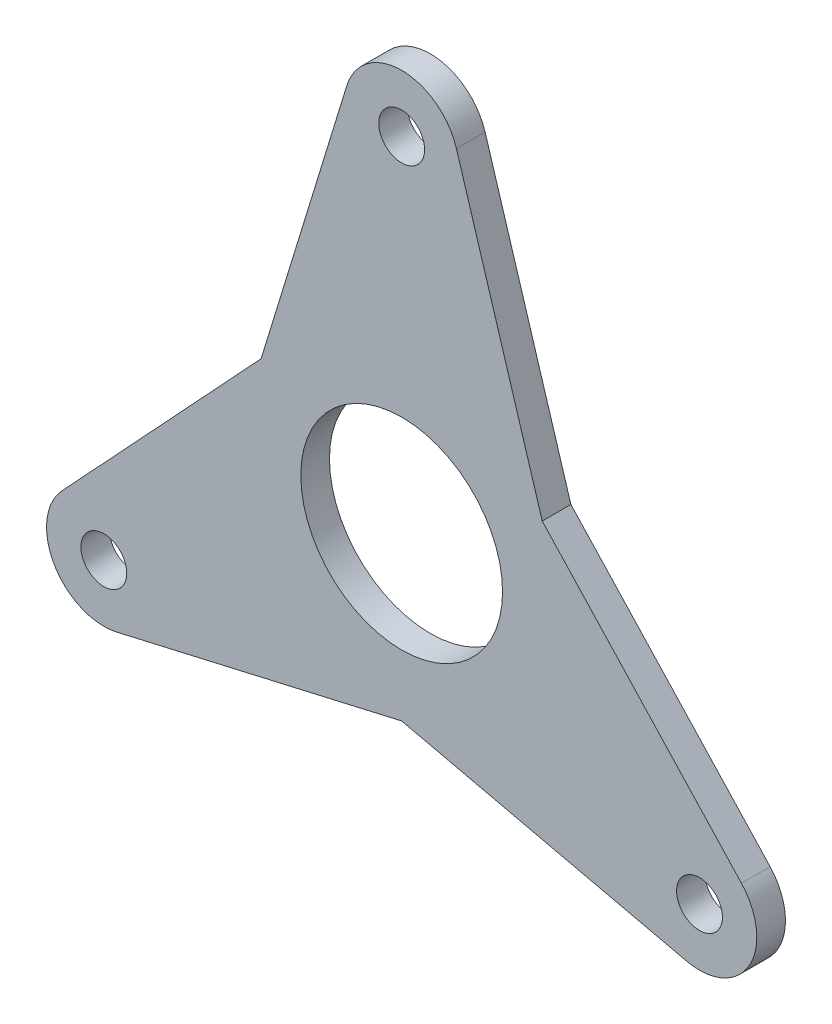
ISO-10303-21;
HEADER;
FILE_DESCRIPTION(('STEP AP214'),'2;1');
FILE_NAME('part.step','',(''),(''),'','','');
FILE_SCHEMA(('AUTOMOTIVE_DESIGN { 1 0 10303 214 1 1 1 1 }'));
ENDSEC;
DATA;
#1=APPLICATION_CONTEXT('core data for automotive mechanical design processes');
#2=APPLICATION_PROTOCOL_DEFINITION('international standard','automotive_design',2000,#1);
#3=PRODUCT_CONTEXT('',#1,'mechanical');
#4=PRODUCT('Part','Part','',(#3));
#5=PRODUCT_RELATED_PRODUCT_CATEGORY('part','',(#4));
#6=PRODUCT_DEFINITION_FORMATION('','',#4);
#7=PRODUCT_DEFINITION_CONTEXT('part definition',#1,'design');
#8=PRODUCT_DEFINITION('design','',#6,#7);
#9=PRODUCT_DEFINITION_SHAPE('','',#8);
#10=(LENGTH_UNIT() NAMED_UNIT(*) SI_UNIT(.MILLI.,.METRE.));
#11=(NAMED_UNIT(*) PLANE_ANGLE_UNIT() SI_UNIT($,.RADIAN.));
#12=(NAMED_UNIT(*) SI_UNIT($,.STERADIAN.) SOLID_ANGLE_UNIT());
#13=UNCERTAINTY_MEASURE_WITH_UNIT(LENGTH_MEASURE(1.E-05),#10,'distance_accuracy_value','');
#14=(GEOMETRIC_REPRESENTATION_CONTEXT(3) GLOBAL_UNCERTAINTY_ASSIGNED_CONTEXT((#13)) GLOBAL_UNIT_ASSIGNED_CONTEXT((#10,
#11,#12)) REPRESENTATION_CONTEXT('',''));
#15=CARTESIAN_POINT('',(0.,0.,0.));
#16=DIRECTION('',(0.,0.,1.));
#17=DIRECTION('',(1.,0.,0.));
#18=AXIS2_PLACEMENT_3D('',#15,#16,#17);
#19=CARTESIAN_POINT('',(0.,38.1,3.175));
#20=DIRECTION('',(0.,0.,1.));
#21=DIRECTION('',(1.,0.,0.));
#22=AXIS2_PLACEMENT_3D('',#19,#20,#21);
#23=PLANE('',#22);
#24=CARTESIAN_POINT('',(32.9955678841871,-19.05,3.175));
#25=DIRECTION('',(0.,0.,1.));
#26=DIRECTION('',(1.,0.,0.));
#27=AXIS2_PLACEMENT_3D('',#24,#25,#26);
#28=CIRCLE('',#27,2.54);
#29=CARTESIAN_POINT('',(35.5355678841871,-19.05,3.175));
#30=VERTEX_POINT('',#29);
#31=EDGE_CURVE('E204',#30,#30,#28,.T.);
#32=ORIENTED_EDGE('',*,*,#31,.F.);
#33=EDGE_LOOP('',(#32));
#34=FACE_BOUND('',#33,.T.);
#35=CARTESIAN_POINT('',(0.,0.,3.175));
#36=DIRECTION('',(0.,0.,1.));
#37=DIRECTION('',(1.,0.,0.));
#38=AXIS2_PLACEMENT_3D('',#35,#36,#37);
#39=CIRCLE('',#38,11.176);
#40=CARTESIAN_POINT('',(11.176,0.,3.175));
#41=VERTEX_POINT('',#40);
#42=EDGE_CURVE('E140',#41,#41,#39,.T.);
#43=ORIENTED_EDGE('',*,*,#42,.F.);
#44=EDGE_LOOP('',(#43));
#45=FACE_BOUND('',#44,.T.);
#46=CARTESIAN_POINT('',(0.,38.1,3.175));
#47=DIRECTION('',(0.,0.,1.));
#48=DIRECTION('',(1.,0.,0.));
#49=AXIS2_PLACEMENT_3D('',#46,#47,#48);
#50=CIRCLE('',#49,6.35);
#51=CARTESIAN_POINT('',(6.07066494618908,39.9626666666667,3.175));
#52=VERTEX_POINT('',#51);
#53=CARTESIAN_POINT('',(-6.07066494618908,39.9626666666667,3.175));
#54=VERTEX_POINT('',#53);
#55=EDGE_CURVE('E153',#52,#54,#50,.T.);
#56=ORIENTED_EDGE('',*,*,#55,.T.);
#57=DIRECTION('',(-0.293333333333333,-0.956010227746312,0.));
#58=VECTOR('',#57,1.);
#59=CARTESIAN_POINT('',(-6.07066494618908,39.9626666666667,3.175));
#60=LINE('',#59,#58);
#61=CARTESIAN_POINT('',(-15.5735958110021,8.9914197337325,3.175));
#62=VERTEX_POINT('',#61);
#63=EDGE_CURVE('E96',#54,#62,#60,.T.);
#64=ORIENTED_EDGE('',*,*,#63,.T.);
#65=DIRECTION('',(-0.681262476839386,-0.732039232316592,0.));
#66=VECTOR('',#65,1.);
#67=CARTESIAN_POINT('',(-37.6440170093975,-14.7239832720699,3.175));
#68=LINE('',#67,#66);
#69=CARTESIAN_POINT('',(-37.6440170093975,-14.7239832720699,3.175));
#70=VERTEX_POINT('',#69);
#71=EDGE_CURVE('E171',#62,#70,#68,.T.);
#72=ORIENTED_EDGE('',*,*,#71,.T.);
#73=CARTESIAN_POINT('',(-32.9955678841871,-19.05,3.175));
#74=DIRECTION('',(0.,0.,1.));
#75=DIRECTION('',(1.,0.,0.));
#76=AXIS2_PLACEMENT_3D('',#73,#74,#75);
#77=CIRCLE('',#76,6.35);
#78=CARTESIAN_POINT('',(-31.5733520632084,-25.2386833945968,3.175));
#79=VERTEX_POINT('',#78);
#80=EDGE_CURVE('E188',#70,#79,#77,.T.);
#81=ORIENTED_EDGE('',*,*,#80,.T.);
#82=DIRECTION('',(0.97459581017272,0.223970995429721,0.));
#83=VECTOR('',#82,1.);
#84=CARTESIAN_POINT('',(-31.5733520632084,-25.2386833945968,3.175));
#85=LINE('',#84,#83);
#86=CARTESIAN_POINT('',(0.,-17.982839467465,3.175));
#87=VERTEX_POINT('',#86);
#88=EDGE_CURVE('E187',#79,#87,#85,.T.);
#89=ORIENTED_EDGE('',*,*,#88,.T.);
#90=DIRECTION('',(0.97459581017272,-0.22397099542972,0.));
#91=VECTOR('',#90,1.);
#92=CARTESIAN_POINT('',(31.5733520632084,-25.2386833945968,3.175));
#93=LINE('',#92,#91);
#94=CARTESIAN_POINT('',(31.5733520632084,-25.2386833945968,3.175));
#95=VERTEX_POINT('',#94);
#96=EDGE_CURVE('E118',#87,#95,#93,.T.);
#97=ORIENTED_EDGE('',*,*,#96,.T.);
#98=CARTESIAN_POINT('',(32.9955678841871,-19.05,3.175));
#99=DIRECTION('',(0.,0.,1.));
#100=DIRECTION('',(1.,0.,0.));
#101=AXIS2_PLACEMENT_3D('',#98,#99,#100);
#102=CIRCLE('',#101,6.35);
#103=CARTESIAN_POINT('',(37.6440170093975,-14.7239832720699,3.175));
#104=VERTEX_POINT('',#103);
#105=EDGE_CURVE('E112',#95,#104,#102,.T.);
#106=ORIENTED_EDGE('',*,*,#105,.T.);
#107=DIRECTION('',(-0.681262476839387,0.732039232316591,0.));
#108=VECTOR('',#107,1.);
#109=CARTESIAN_POINT('',(37.6440170093975,-14.7239832720699,3.175));
#110=LINE('',#109,#108);
#111=CARTESIAN_POINT('',(15.5735958110021,8.99141973373248,3.175));
#112=VERTEX_POINT('',#111);
#113=EDGE_CURVE('E116',#104,#112,#110,.T.);
#114=ORIENTED_EDGE('',*,*,#113,.T.);
#115=DIRECTION('',(-0.293333333333333,0.956010227746312,0.));
#116=VECTOR('',#115,1.);
#117=CARTESIAN_POINT('',(6.07066494618908,39.9626666666667,3.175));
#118=LINE('',#117,#116);
#119=EDGE_CURVE('E50',#112,#52,#118,.T.);
#120=ORIENTED_EDGE('',*,*,#119,.T.);
#121=EDGE_LOOP('',(#56,#64,#72,#81,#89,#97,#106,#114,#120));
#122=FACE_BOUND('',#121,.T.);
#123=CARTESIAN_POINT('',(0.,38.1,3.175));
#124=DIRECTION('',(0.,0.,1.));
#125=DIRECTION('',(1.,0.,0.));
#126=AXIS2_PLACEMENT_3D('',#123,#124,#125);
#127=CIRCLE('',#126,2.54);
#128=CARTESIAN_POINT('',(2.54,38.1,3.175));
#129=VERTEX_POINT('',#128);
#130=EDGE_CURVE('E198',#129,#129,#127,.T.);
#131=ORIENTED_EDGE('',*,*,#130,.F.);
#132=EDGE_LOOP('',(#131));
#133=FACE_BOUND('',#132,.T.);
#134=CARTESIAN_POINT('',(-32.9955678841871,-19.05,3.175));
#135=DIRECTION('',(0.,0.,1.));
#136=DIRECTION('',(1.,0.,0.));
#137=AXIS2_PLACEMENT_3D('',#134,#135,#136);
#138=CIRCLE('',#137,2.54000000000001);
#139=CARTESIAN_POINT('',(-30.4555678841871,-19.05,3.175));
#140=VERTEX_POINT('',#139);
#141=EDGE_CURVE('E210',#140,#140,#138,.T.);
#142=ORIENTED_EDGE('',*,*,#141,.F.);
#143=EDGE_LOOP('',(#142));
#144=FACE_BOUND('',#143,.T.);
#145=ADVANCED_FACE('F33',(#34,#45,#122,#133,#144),#23,.T.);
#146=CARTESIAN_POINT('',(0.,38.1,0.));
#147=DIRECTION('',(0.,0.,1.));
#148=DIRECTION('',(1.,0.,0.));
#149=AXIS2_PLACEMENT_3D('',#146,#147,#148);
#150=PLANE('',#149);
#151=CARTESIAN_POINT('',(0.,38.1,0.));
#152=DIRECTION('',(0.,0.,1.));
#153=DIRECTION('',(1.,0.,0.));
#154=AXIS2_PLACEMENT_3D('',#151,#152,#153);
#155=CIRCLE('',#154,6.35);
#156=CARTESIAN_POINT('',(6.07066494618908,39.9626666666667,0.));
#157=VERTEX_POINT('',#156);
#158=CARTESIAN_POINT('',(-6.07066494618908,39.9626666666667,0.));
#159=VERTEX_POINT('',#158);
#160=EDGE_CURVE('E136',#157,#159,#155,.T.);
#161=ORIENTED_EDGE('',*,*,#160,.F.);
#162=DIRECTION('',(-0.293333333333333,0.956010227746312,0.));
#163=VECTOR('',#162,1.);
#164=CARTESIAN_POINT('',(6.07066494618908,39.9626666666667,0.));
#165=LINE('',#164,#163);
#166=CARTESIAN_POINT('',(15.5735958110021,8.99141973373248,0.));
#167=VERTEX_POINT('',#166);
#168=EDGE_CURVE('E88',#167,#157,#165,.T.);
#169=ORIENTED_EDGE('',*,*,#168,.F.);
#170=DIRECTION('',(-0.681262476839387,0.732039232316591,0.));
#171=VECTOR('',#170,1.);
#172=CARTESIAN_POINT('',(37.6440170093975,-14.7239832720699,0.));
#173=LINE('',#172,#171);
#174=CARTESIAN_POINT('',(37.6440170093975,-14.7239832720699,0.));
#175=VERTEX_POINT('',#174);
#176=EDGE_CURVE('E82',#175,#167,#173,.T.);
#177=ORIENTED_EDGE('',*,*,#176,.F.);
#178=CARTESIAN_POINT('',(32.9955678841871,-19.05,0.));
#179=DIRECTION('',(0.,0.,1.));
#180=DIRECTION('',(1.,0.,0.));
#181=AXIS2_PLACEMENT_3D('',#178,#179,#180);
#182=CIRCLE('',#181,6.35);
#183=CARTESIAN_POINT('',(31.5733520632084,-25.2386833945968,0.));
#184=VERTEX_POINT('',#183);
#185=EDGE_CURVE('E126',#184,#175,#182,.T.);
#186=ORIENTED_EDGE('',*,*,#185,.F.);
#187=DIRECTION('',(0.97459581017272,-0.22397099542972,0.));
#188=VECTOR('',#187,1.);
#189=CARTESIAN_POINT('',(31.5733520632084,-25.2386833945968,0.));
#190=LINE('',#189,#188);
#191=CARTESIAN_POINT('',(0.,-17.982839467465,0.));
#192=VERTEX_POINT('',#191);
#193=EDGE_CURVE('E148',#192,#184,#190,.T.);
#194=ORIENTED_EDGE('',*,*,#193,.F.);
#195=DIRECTION('',(0.97459581017272,0.223970995429721,0.));
#196=VECTOR('',#195,1.);
#197=CARTESIAN_POINT('',(-31.5733520632084,-25.2386833945968,0.));
#198=LINE('',#197,#196);
#199=CARTESIAN_POINT('',(-31.5733520632084,-25.2386833945968,0.));
#200=VERTEX_POINT('',#199);
#201=EDGE_CURVE('E146',#200,#192,#198,.T.);
#202=ORIENTED_EDGE('',*,*,#201,.F.);
#203=CARTESIAN_POINT('',(-32.9955678841871,-19.05,0.));
#204=DIRECTION('',(0.,0.,1.));
#205=DIRECTION('',(1.,0.,0.));
#206=AXIS2_PLACEMENT_3D('',#203,#204,#205);
#207=CIRCLE('',#206,6.35);
#208=CARTESIAN_POINT('',(-37.6440170093975,-14.7239832720699,0.));
#209=VERTEX_POINT('',#208);
#210=EDGE_CURVE('E144',#209,#200,#207,.T.);
#211=ORIENTED_EDGE('',*,*,#210,.F.);
#212=DIRECTION('',(-0.681262476839386,-0.732039232316592,0.));
#213=VECTOR('',#212,1.);
#214=CARTESIAN_POINT('',(-37.6440170093975,-14.7239832720699,0.));
#215=LINE('',#214,#213);
#216=CARTESIAN_POINT('',(-15.5735958110021,8.9914197337325,0.));
#217=VERTEX_POINT('',#216);
#218=EDGE_CURVE('E142',#217,#209,#215,.T.);
#219=ORIENTED_EDGE('',*,*,#218,.F.);
#220=DIRECTION('',(-0.293333333333333,-0.956010227746312,0.));
#221=VECTOR('',#220,1.);
#222=CARTESIAN_POINT('',(-6.07066494618908,39.9626666666667,0.));
#223=LINE('',#222,#221);
#224=EDGE_CURVE('E139',#159,#217,#223,.T.);
#225=ORIENTED_EDGE('',*,*,#224,.F.);
#226=EDGE_LOOP('',(#161,#169,#177,#186,#194,#202,#211,#219,#225));
#227=FACE_BOUND('',#226,.T.);
#228=CARTESIAN_POINT('',(0.,0.,0.));
#229=DIRECTION('',(0.,0.,1.));
#230=DIRECTION('',(1.,0.,0.));
#231=AXIS2_PLACEMENT_3D('',#228,#229,#230);
#232=CIRCLE('',#231,11.176);
#233=CARTESIAN_POINT('',(11.176,0.,0.));
#234=VERTEX_POINT('',#233);
#235=EDGE_CURVE('E195',#234,#234,#232,.T.);
#236=ORIENTED_EDGE('',*,*,#235,.T.);
#237=EDGE_LOOP('',(#236));
#238=FACE_BOUND('',#237,.T.);
#239=CARTESIAN_POINT('',(0.,38.1,0.));
#240=DIRECTION('',(0.,0.,1.));
#241=DIRECTION('',(1.,0.,0.));
#242=AXIS2_PLACEMENT_3D('',#239,#240,#241);
#243=CIRCLE('',#242,2.54);
#244=CARTESIAN_POINT('',(2.54,38.1,0.));
#245=VERTEX_POINT('',#244);
#246=EDGE_CURVE('E201',#245,#245,#243,.T.);
#247=ORIENTED_EDGE('',*,*,#246,.T.);
#248=EDGE_LOOP('',(#247));
#249=FACE_BOUND('',#248,.T.);
#250=CARTESIAN_POINT('',(32.9955678841871,-19.05,0.));
#251=DIRECTION('',(0.,0.,1.));
#252=DIRECTION('',(1.,0.,0.));
#253=AXIS2_PLACEMENT_3D('',#250,#251,#252);
#254=CIRCLE('',#253,2.54);
#255=CARTESIAN_POINT('',(35.5355678841871,-19.05,0.));
#256=VERTEX_POINT('',#255);
#257=EDGE_CURVE('E207',#256,#256,#254,.T.);
#258=ORIENTED_EDGE('',*,*,#257,.T.);
#259=EDGE_LOOP('',(#258));
#260=FACE_BOUND('',#259,.T.);
#261=CARTESIAN_POINT('',(-32.9955678841871,-19.05,0.));
#262=DIRECTION('',(0.,0.,1.));
#263=DIRECTION('',(1.,0.,0.));
#264=AXIS2_PLACEMENT_3D('',#261,#262,#263);
#265=CIRCLE('',#264,2.54000000000001);
#266=CARTESIAN_POINT('',(-30.4555678841871,-19.05,0.));
#267=VERTEX_POINT('',#266);
#268=EDGE_CURVE('E213',#267,#267,#265,.T.);
#269=ORIENTED_EDGE('',*,*,#268,.T.);
#270=EDGE_LOOP('',(#269));
#271=FACE_BOUND('',#270,.T.);
#272=ADVANCED_FACE('F175',(#227,#238,#249,#260,#271),#150,.F.);
#273=CARTESIAN_POINT('',(0.,38.1,3.175));
#274=DIRECTION('',(0.,0.,-1.));
#275=DIRECTION('',(-1.,0.,0.));
#276=AXIS2_PLACEMENT_3D('',#273,#274,#275);
#277=CYLINDRICAL_SURFACE('',#276,6.35);
#278=ORIENTED_EDGE('',*,*,#160,.T.);
#279=DIRECTION('',(0.,0.,-1.));
#280=VECTOR('',#279,1.);
#281=CARTESIAN_POINT('',(-6.07066494618908,39.9626666666667,3.175));
#282=LINE('',#281,#280);
#283=EDGE_CURVE('E11',#54,#159,#282,.T.);
#284=ORIENTED_EDGE('',*,*,#283,.F.);
#285=ORIENTED_EDGE('',*,*,#55,.F.);
#286=DIRECTION('',(0.,0.,-1.));
#287=VECTOR('',#286,1.);
#288=CARTESIAN_POINT('',(6.07066494618908,39.9626666666667,3.175));
#289=LINE('',#288,#287);
#290=EDGE_CURVE('E132',#52,#157,#289,.T.);
#291=ORIENTED_EDGE('',*,*,#290,.T.);
#292=EDGE_LOOP('',(#278,#284,#285,#291));
#293=FACE_BOUND('',#292,.T.);
#294=ADVANCED_FACE('F35',(#293),#277,.T.);
#295=CARTESIAN_POINT('',(-6.07066494618908,39.9626666666667,3.175));
#296=DIRECTION('',(0.956010227746312,-0.293333333333333,0.));
#297=DIRECTION('',(0.293333333333333,0.956010227746312,0.));
#298=AXIS2_PLACEMENT_3D('',#295,#296,#297);
#299=PLANE('',#298);
#300=ORIENTED_EDGE('',*,*,#224,.T.);
#301=DIRECTION('',(0.,0.,-1.));
#302=VECTOR('',#301,1.);
#303=CARTESIAN_POINT('',(-15.5735958110021,8.9914197337325,3.175));
#304=LINE('',#303,#302);
#305=EDGE_CURVE('E42',#62,#217,#304,.T.);
#306=ORIENTED_EDGE('',*,*,#305,.F.);
#307=ORIENTED_EDGE('',*,*,#63,.F.);
#308=ORIENTED_EDGE('',*,*,#283,.T.);
#309=EDGE_LOOP('',(#300,#306,#307,#308));
#310=FACE_BOUND('',#309,.T.);
#311=ADVANCED_FACE('F251',(#310),#299,.F.);
#312=CARTESIAN_POINT('',(-37.6440170093975,-14.7239832720699,3.175));
#313=DIRECTION('',(0.732039232316592,-0.681262476839386,0.));
#314=DIRECTION('',(0.681262476839386,0.732039232316592,0.));
#315=AXIS2_PLACEMENT_3D('',#312,#313,#314);
#316=PLANE('',#315);
#317=ORIENTED_EDGE('',*,*,#218,.T.);
#318=DIRECTION('',(0.,0.,-1.));
#319=VECTOR('',#318,1.);
#320=CARTESIAN_POINT('',(-37.6440170093975,-14.7239832720699,3.175));
#321=LINE('',#320,#319);
#322=EDGE_CURVE('E163',#70,#209,#321,.T.);
#323=ORIENTED_EDGE('',*,*,#322,.F.);
#324=ORIENTED_EDGE('',*,*,#71,.F.);
#325=ORIENTED_EDGE('',*,*,#305,.T.);
#326=EDGE_LOOP('',(#317,#323,#324,#325));
#327=FACE_BOUND('',#326,.T.);
#328=ADVANCED_FACE('F169',(#327),#316,.F.);
#329=CARTESIAN_POINT('',(-32.9955678841871,-19.05,3.175));
#330=DIRECTION('',(0.,0.,-1.));
#331=DIRECTION('',(-1.,0.,0.));
#332=AXIS2_PLACEMENT_3D('',#329,#330,#331);
#333=CYLINDRICAL_SURFACE('',#332,6.35);
#334=ORIENTED_EDGE('',*,*,#210,.T.);
#335=DIRECTION('',(0.,0.,-1.));
#336=VECTOR('',#335,1.);
#337=CARTESIAN_POINT('',(-31.5733520632084,-25.2386833945968,3.175));
#338=LINE('',#337,#336);
#339=EDGE_CURVE('E160',#79,#200,#338,.T.);
#340=ORIENTED_EDGE('',*,*,#339,.F.);
#341=ORIENTED_EDGE('',*,*,#80,.F.);
#342=ORIENTED_EDGE('',*,*,#322,.T.);
#343=EDGE_LOOP('',(#334,#340,#341,#342));
#344=FACE_BOUND('',#343,.T.);
#345=ADVANCED_FACE('F181',(#344),#333,.T.);
#346=CARTESIAN_POINT('',(-31.5733520632084,-25.2386833945968,3.175));
#347=DIRECTION('',(-0.223970995429721,0.97459581017272,0.));
#348=DIRECTION('',(-0.97459581017272,-0.223970995429721,0.));
#349=AXIS2_PLACEMENT_3D('',#346,#347,#348);
#350=PLANE('',#349);
#351=ORIENTED_EDGE('',*,*,#201,.T.);
#352=DIRECTION('',(0.,0.,-1.));
#353=VECTOR('',#352,1.);
#354=CARTESIAN_POINT('',(0.,-17.982839467465,3.175));
#355=LINE('',#354,#353);
#356=EDGE_CURVE('E157',#87,#192,#355,.T.);
#357=ORIENTED_EDGE('',*,*,#356,.F.);
#358=ORIENTED_EDGE('',*,*,#88,.F.);
#359=ORIENTED_EDGE('',*,*,#339,.T.);
#360=EDGE_LOOP('',(#351,#357,#358,#359));
#361=FACE_BOUND('',#360,.T.);
#362=ADVANCED_FACE('F185',(#361),#350,.F.);
#363=CARTESIAN_POINT('',(31.5733520632084,-25.2386833945968,3.175));
#364=DIRECTION('',(0.22397099542972,0.97459581017272,0.));
#365=DIRECTION('',(-0.97459581017272,0.22397099542972,0.));
#366=AXIS2_PLACEMENT_3D('',#363,#364,#365);
#367=PLANE('',#366);
#368=ORIENTED_EDGE('',*,*,#193,.T.);
#369=DIRECTION('',(0.,0.,-1.));
#370=VECTOR('',#369,1.);
#371=CARTESIAN_POINT('',(31.5733520632084,-25.2386833945968,3.175));
#372=LINE('',#371,#370);
#373=EDGE_CURVE('E127',#95,#184,#372,.T.);
#374=ORIENTED_EDGE('',*,*,#373,.F.);
#375=ORIENTED_EDGE('',*,*,#96,.F.);
#376=ORIENTED_EDGE('',*,*,#356,.T.);
#377=EDGE_LOOP('',(#368,#374,#375,#376));
#378=FACE_BOUND('',#377,.T.);
#379=ADVANCED_FACE('F242',(#378),#367,.F.);
#380=CARTESIAN_POINT('',(32.9955678841871,-19.05,3.175));
#381=DIRECTION('',(0.,0.,-1.));
#382=DIRECTION('',(-1.,0.,0.));
#383=AXIS2_PLACEMENT_3D('',#380,#381,#382);
#384=CYLINDRICAL_SURFACE('',#383,6.35);
#385=ORIENTED_EDGE('',*,*,#185,.T.);
#386=DIRECTION('',(0.,0.,-1.));
#387=VECTOR('',#386,1.);
#388=CARTESIAN_POINT('',(37.6440170093975,-14.7239832720699,3.175));
#389=LINE('',#388,#387);
#390=EDGE_CURVE('E123',#104,#175,#389,.T.);
#391=ORIENTED_EDGE('',*,*,#390,.F.);
#392=ORIENTED_EDGE('',*,*,#105,.F.);
#393=ORIENTED_EDGE('',*,*,#373,.T.);
#394=EDGE_LOOP('',(#385,#391,#392,#393));
#395=FACE_BOUND('',#394,.T.);
#396=ADVANCED_FACE('F124',(#395),#384,.T.);
#397=CARTESIAN_POINT('',(37.6440170093975,-14.7239832720699,3.175));
#398=DIRECTION('',(-0.732039232316591,-0.681262476839387,0.));
#399=DIRECTION('',(0.681262476839387,-0.732039232316591,0.));
#400=AXIS2_PLACEMENT_3D('',#397,#398,#399);
#401=PLANE('',#400);
#402=ORIENTED_EDGE('',*,*,#176,.T.);
#403=DIRECTION('',(0.,0.,-1.));
#404=VECTOR('',#403,1.);
#405=CARTESIAN_POINT('',(15.5735958110021,8.99141973373248,3.175));
#406=LINE('',#405,#404);
#407=EDGE_CURVE('E128',#112,#167,#406,.T.);
#408=ORIENTED_EDGE('',*,*,#407,.F.);
#409=ORIENTED_EDGE('',*,*,#113,.F.);
#410=ORIENTED_EDGE('',*,*,#390,.T.);
#411=EDGE_LOOP('',(#402,#408,#409,#410));
#412=FACE_BOUND('',#411,.T.);
#413=ADVANCED_FACE('F130',(#412),#401,.F.);
#414=CARTESIAN_POINT('',(6.07066494618908,39.9626666666667,3.175));
#415=DIRECTION('',(-0.956010227746312,-0.293333333333334,0.));
#416=DIRECTION('',(0.293333333333334,-0.956010227746312,0.));
#417=AXIS2_PLACEMENT_3D('',#414,#415,#416);
#418=PLANE('',#417);
#419=ORIENTED_EDGE('',*,*,#168,.T.);
#420=ORIENTED_EDGE('',*,*,#290,.F.);
#421=ORIENTED_EDGE('',*,*,#119,.F.);
#422=ORIENTED_EDGE('',*,*,#407,.T.);
#423=EDGE_LOOP('',(#419,#420,#421,#422));
#424=FACE_BOUND('',#423,.T.);
#425=ADVANCED_FACE('F235',(#424),#418,.F.);
#426=CARTESIAN_POINT('',(0.,0.,3.175));
#427=DIRECTION('',(0.,0.,-1.));
#428=DIRECTION('',(-1.,0.,0.));
#429=AXIS2_PLACEMENT_3D('',#426,#427,#428);
#430=CYLINDRICAL_SURFACE('',#429,11.176);
#431=ORIENTED_EDGE('',*,*,#42,.T.);
#432=EDGE_LOOP('',(#431));
#433=FACE_BOUND('',#432,.T.);
#434=ORIENTED_EDGE('',*,*,#235,.F.);
#435=EDGE_LOOP('',(#434));
#436=FACE_BOUND('',#435,.T.);
#437=ADVANCED_FACE('F232',(#433,#436),#430,.F.);
#438=CARTESIAN_POINT('',(0.,38.1,3.175));
#439=DIRECTION('',(0.,0.,-1.));
#440=DIRECTION('',(-1.,0.,0.));
#441=AXIS2_PLACEMENT_3D('',#438,#439,#440);
#442=CYLINDRICAL_SURFACE('',#441,2.54);
#443=ORIENTED_EDGE('',*,*,#130,.T.);
#444=EDGE_LOOP('',(#443));
#445=FACE_BOUND('',#444,.T.);
#446=ORIENTED_EDGE('',*,*,#246,.F.);
#447=EDGE_LOOP('',(#446));
#448=FACE_BOUND('',#447,.T.);
#449=ADVANCED_FACE('F320',(#445,#448),#442,.F.);
#450=CARTESIAN_POINT('',(32.9955678841871,-19.05,3.175));
#451=DIRECTION('',(0.,0.,-1.));
#452=DIRECTION('',(-1.,0.,0.));
#453=AXIS2_PLACEMENT_3D('',#450,#451,#452);
#454=CYLINDRICAL_SURFACE('',#453,2.54);
#455=ORIENTED_EDGE('',*,*,#31,.T.);
#456=EDGE_LOOP('',(#455));
#457=FACE_BOUND('',#456,.T.);
#458=ORIENTED_EDGE('',*,*,#257,.F.);
#459=EDGE_LOOP('',(#458));
#460=FACE_BOUND('',#459,.T.);
#461=ADVANCED_FACE('F328',(#457,#460),#454,.F.);
#462=CARTESIAN_POINT('',(-32.9955678841871,-19.05,3.175));
#463=DIRECTION('',(0.,0.,-1.));
#464=DIRECTION('',(-1.,0.,0.));
#465=AXIS2_PLACEMENT_3D('',#462,#463,#464);
#466=CYLINDRICAL_SURFACE('',#465,2.54000000000001);
#467=ORIENTED_EDGE('',*,*,#141,.T.);
#468=EDGE_LOOP('',(#467));
#469=FACE_BOUND('',#468,.T.);
#470=ORIENTED_EDGE('',*,*,#268,.F.);
#471=EDGE_LOOP('',(#470));
#472=FACE_BOUND('',#471,.T.);
#473=ADVANCED_FACE('F219',(#469,#472),#466,.F.);
#474=CLOSED_SHELL('',(#145,#272,#294,#311,#328,#345,#362,#379,#396,#413,#425,#437,#449,#461,#473));
#475=MANIFOLD_SOLID_BREP('B2',#474);
#476=ADVANCED_BREP_SHAPE_REPRESENTATION('',(#18,#475),#14);
#477=SHAPE_DEFINITION_REPRESENTATION(#9,#476);
ENDSEC;
END-ISO-10303-21;
